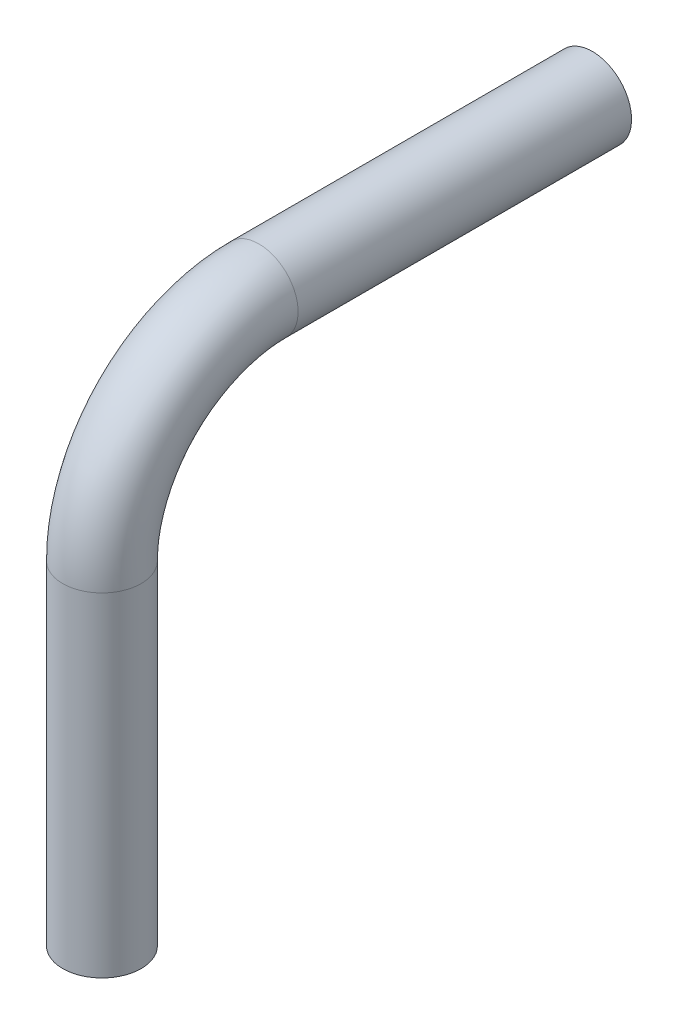
ISO-10303-21;
HEADER;
FILE_DESCRIPTION(('STEP AP214'),'2;1');
FILE_NAME('part.step','',(''),(''),'','','');
FILE_SCHEMA(('AUTOMOTIVE_DESIGN { 1 0 10303 214 1 1 1 1 }'));
ENDSEC;
DATA;
#1=APPLICATION_CONTEXT('core data for automotive mechanical design processes');
#2=APPLICATION_PROTOCOL_DEFINITION('international standard','automotive_design',2000,#1);
#3=PRODUCT_CONTEXT('',#1,'mechanical');
#4=PRODUCT('Part','Part','',(#3));
#5=PRODUCT_RELATED_PRODUCT_CATEGORY('part','',(#4));
#6=PRODUCT_DEFINITION_FORMATION('','',#4);
#7=PRODUCT_DEFINITION_CONTEXT('part definition',#1,'design');
#8=PRODUCT_DEFINITION('design','',#6,#7);
#9=PRODUCT_DEFINITION_SHAPE('','',#8);
#10=(LENGTH_UNIT() NAMED_UNIT(*) SI_UNIT(.MILLI.,.METRE.));
#11=(NAMED_UNIT(*) PLANE_ANGLE_UNIT() SI_UNIT($,.RADIAN.));
#12=(NAMED_UNIT(*) SI_UNIT($,.STERADIAN.) SOLID_ANGLE_UNIT());
#13=UNCERTAINTY_MEASURE_WITH_UNIT(LENGTH_MEASURE(1.E-05),#10,'distance_accuracy_value','');
#14=(GEOMETRIC_REPRESENTATION_CONTEXT(3) GLOBAL_UNCERTAINTY_ASSIGNED_CONTEXT((#13)) GLOBAL_UNIT_ASSIGNED_CONTEXT((#10,
#11,#12)) REPRESENTATION_CONTEXT('',''));
#15=CARTESIAN_POINT('',(0.,0.,0.));
#16=DIRECTION('',(0.,0.,1.));
#17=DIRECTION('',(1.,0.,0.));
#18=AXIS2_PLACEMENT_3D('',#15,#16,#17);
#19=CARTESIAN_POINT('',(0.,-5.,0.));
#20=DIRECTION('',(0.,1.,0.));
#21=DIRECTION('',(-1.,0.,0.));
#22=AXIS2_PLACEMENT_3D('',#19,#20,#21);
#23=PLANE('',#22);
#24=CARTESIAN_POINT('',(0.,-5.,0.));
#25=DIRECTION('',(0.,1.,0.));
#26=DIRECTION('',(-1.,0.,0.));
#27=AXIS2_PLACEMENT_3D('',#24,#25,#26);
#28=CIRCLE('',#27,0.4);
#29=CARTESIAN_POINT('',(-0.4,-5.,0.));
#30=VERTEX_POINT('',#29);
#31=EDGE_CURVE('E49',#30,#30,#28,.T.);
#32=ORIENTED_EDGE('',*,*,#31,.F.);
#33=EDGE_LOOP('',(#32));
#34=FACE_BOUND('',#33,.T.);
#35=ADVANCED_FACE('F37',(#34),#23,.F.);
#36=CARTESIAN_POINT('',(0.,0.,-5.));
#37=DIRECTION('',(0.,0.,-1.));
#38=DIRECTION('',(-1.,0.,0.));
#39=AXIS2_PLACEMENT_3D('',#36,#37,#38);
#40=PLANE('',#39);
#41=CARTESIAN_POINT('',(0.,0.,-5.));
#42=DIRECTION('',(0.,0.,-1.));
#43=DIRECTION('',(-1.,0.,0.));
#44=AXIS2_PLACEMENT_3D('',#41,#42,#43);
#45=CIRCLE('',#44,0.4);
#46=CARTESIAN_POINT('',(-0.4,0.,-5.));
#47=VERTEX_POINT('',#46);
#48=EDGE_CURVE('E11',#47,#47,#45,.T.);
#49=ORIENTED_EDGE('',*,*,#48,.T.);
#50=EDGE_LOOP('',(#49));
#51=FACE_BOUND('',#50,.T.);
#52=ADVANCED_FACE('F52',(#51),#40,.T.);
#53=CARTESIAN_POINT('',(0.,-5.,0.));
#54=DIRECTION('',(0.,1.,0.));
#55=DIRECTION('',(0.,0.,1.));
#56=AXIS2_PLACEMENT_3D('',#53,#54,#55);
#57=CYLINDRICAL_SURFACE('',#56,0.4);
#58=CARTESIAN_POINT('',(0.,-1.60000000000001,0.));
#59=DIRECTION('',(0.,1.,0.));
#60=DIRECTION('',(-1.,0.,0.));
#61=AXIS2_PLACEMENT_3D('',#58,#59,#60);
#62=CIRCLE('',#61,0.4);
#63=CARTESIAN_POINT('',(0.,-1.60000000000001,0.4));
#64=VERTEX_POINT('',#63);
#65=EDGE_CURVE('E62',#64,#64,#62,.T.);
#66=ORIENTED_EDGE('',*,*,#65,.F.);
#67=EDGE_LOOP('',(#66));
#68=FACE_BOUND('',#67,.T.);
#69=ORIENTED_EDGE('',*,*,#31,.T.);
#70=EDGE_LOOP('',(#69));
#71=FACE_BOUND('',#70,.T.);
#72=ADVANCED_FACE('F67',(#68,#71),#57,.T.);
#73=CARTESIAN_POINT('',(0.,-1.6,-1.6));
#74=DIRECTION('',(-1.,0.,0.));
#75=DIRECTION('',(0.,0.,1.));
#76=AXIS2_PLACEMENT_3D('',#73,#74,#75);
#77=TOROIDAL_SURFACE('',#76,1.6,0.4);
#78=CARTESIAN_POINT('',(0.,0.,-1.60000000000001));
#79=DIRECTION('',(0.,0.,-1.));
#80=DIRECTION('',(-1.,0.,0.));
#81=AXIS2_PLACEMENT_3D('',#78,#79,#80);
#82=CIRCLE('',#81,0.4);
#83=CARTESIAN_POINT('',(0.,0.4,-1.60000000000001));
#84=VERTEX_POINT('',#83);
#85=EDGE_CURVE('E44',#84,#84,#82,.T.);
#86=CARTESIAN_POINT('',(0.,-1.6,-1.6));
#87=DIRECTION('',(-1.,0.,0.));
#88=DIRECTION('',(0.,0.,1.));
#89=AXIS2_PLACEMENT_3D('',#86,#87,#88);
#90=CIRCLE('',#89,2.);
#91=EDGE_CURVE('',#64,#84,#90,.T.);
#92=ORIENTED_EDGE('',*,*,#65,.T.);
#93=ORIENTED_EDGE('',*,*,#85,.F.);
#94=ORIENTED_EDGE('',*,*,#91,.T.);
#95=ORIENTED_EDGE('',*,*,#91,.F.);
#96=EDGE_LOOP('',(#92,#94,#93,#95));
#97=FACE_BOUND('',#96,.T.);
#98=ADVANCED_FACE('F57',(#97),#77,.T.);
#99=CARTESIAN_POINT('',(0.,0.,-1.60000000000001));
#100=DIRECTION('',(0.,0.,-1.));
#101=DIRECTION('',(-1.,0.,0.));
#102=AXIS2_PLACEMENT_3D('',#99,#100,#101);
#103=CYLINDRICAL_SURFACE('',#102,0.4);
#104=ORIENTED_EDGE('',*,*,#48,.F.);
#105=EDGE_LOOP('',(#104));
#106=FACE_BOUND('',#105,.T.);
#107=ORIENTED_EDGE('',*,*,#85,.T.);
#108=EDGE_LOOP('',(#107));
#109=FACE_BOUND('',#108,.T.);
#110=ADVANCED_FACE('F54',(#106,#109),#103,.T.);
#111=CLOSED_SHELL('',(#35,#52,#72,#98,#110));
#112=MANIFOLD_SOLID_BREP('B2',#111);
#113=ADVANCED_BREP_SHAPE_REPRESENTATION('',(#18,#112),#14);
#114=SHAPE_DEFINITION_REPRESENTATION(#9,#113);
ENDSEC;
END-ISO-10303-21;
